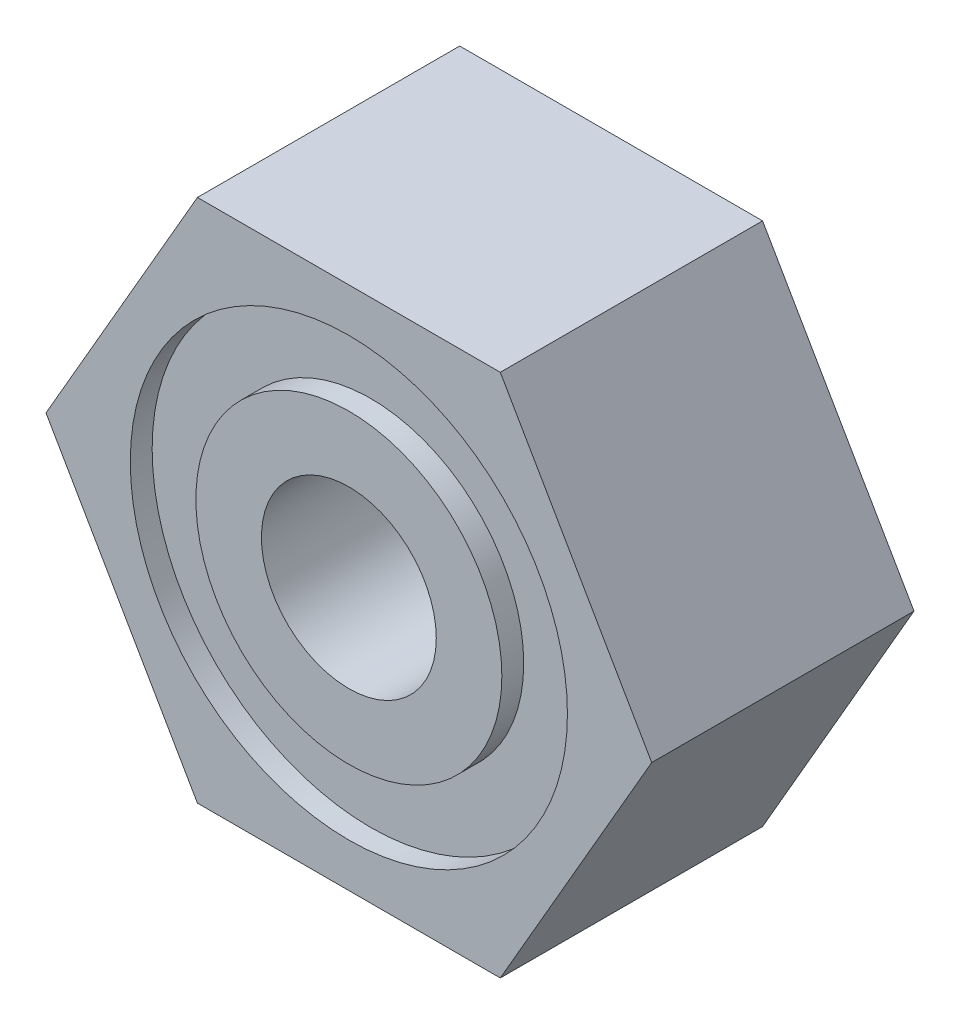
ISO-10303-21;
HEADER;
FILE_DESCRIPTION(('STEP AP214'),'2;1');
FILE_NAME('part.step','',(''),(''),'','','');
FILE_SCHEMA(('AUTOMOTIVE_DESIGN { 1 0 10303 214 1 1 1 1 }'));
ENDSEC;
DATA;
#1=APPLICATION_CONTEXT('core data for automotive mechanical design processes');
#2=APPLICATION_PROTOCOL_DEFINITION('international standard','automotive_design',2000,#1);
#3=PRODUCT_CONTEXT('',#1,'mechanical');
#4=PRODUCT('Part','Part','',(#3));
#5=PRODUCT_RELATED_PRODUCT_CATEGORY('part','',(#4));
#6=PRODUCT_DEFINITION_FORMATION('','',#4);
#7=PRODUCT_DEFINITION_CONTEXT('part definition',#1,'design');
#8=PRODUCT_DEFINITION('design','',#6,#7);
#9=PRODUCT_DEFINITION_SHAPE('','',#8);
#10=(LENGTH_UNIT() NAMED_UNIT(*) SI_UNIT(.MILLI.,.METRE.));
#11=(NAMED_UNIT(*) PLANE_ANGLE_UNIT() SI_UNIT($,.RADIAN.));
#12=(NAMED_UNIT(*) SI_UNIT($,.STERADIAN.) SOLID_ANGLE_UNIT());
#13=UNCERTAINTY_MEASURE_WITH_UNIT(LENGTH_MEASURE(1.E-05),#10,'distance_accuracy_value','');
#14=(GEOMETRIC_REPRESENTATION_CONTEXT(3) GLOBAL_UNCERTAINTY_ASSIGNED_CONTEXT((#13)) GLOBAL_UNIT_ASSIGNED_CONTEXT((#10,
#11,#12)) REPRESENTATION_CONTEXT('',''));
#15=CARTESIAN_POINT('',(0.,0.,0.));
#16=DIRECTION('',(0.,0.,1.));
#17=DIRECTION('',(1.,0.,0.));
#18=AXIS2_PLACEMENT_3D('',#15,#16,#17);
#19=CARTESIAN_POINT('',(0.,0.,6.));
#20=DIRECTION('',(0.,0.,1.));
#21=DIRECTION('',(1.,0.,0.));
#22=AXIS2_PLACEMENT_3D('',#19,#20,#21);
#23=PLANE('',#22);
#24=CARTESIAN_POINT('',(0.,0.,6.));
#25=DIRECTION('',(0.,0.,1.));
#26=DIRECTION('',(1.,0.,0.));
#27=AXIS2_PLACEMENT_3D('',#24,#25,#26);
#28=CIRCLE('',#27,2.);
#29=CARTESIAN_POINT('',(2.,0.,6.));
#30=VERTEX_POINT('',#29);
#31=EDGE_CURVE('E143',#30,#30,#28,.T.);
#32=ORIENTED_EDGE('',*,*,#31,.F.);
#33=EDGE_LOOP('',(#32));
#34=FACE_BOUND('',#33,.T.);
#35=CARTESIAN_POINT('',(0.,0.,6.));
#36=DIRECTION('',(0.,0.,1.));
#37=DIRECTION('',(1.,0.,0.));
#38=AXIS2_PLACEMENT_3D('',#35,#36,#37);
#39=CIRCLE('',#38,3.5);
#40=CARTESIAN_POINT('',(3.5,0.,6.));
#41=VERTEX_POINT('',#40);
#42=EDGE_CURVE('E128',#41,#41,#39,.T.);
#43=ORIENTED_EDGE('',*,*,#42,.T.);
#44=EDGE_LOOP('',(#43));
#45=FACE_BOUND('',#44,.T.);
#46=ADVANCED_FACE('F34',(#34,#45),#23,.T.);
#47=CARTESIAN_POINT('',(0.,0.,6.));
#48=DIRECTION('',(0.,0.,1.));
#49=DIRECTION('',(1.,0.,0.));
#50=AXIS2_PLACEMENT_3D('',#47,#48,#49);
#51=CIRCLE('',#50,5.);
#52=CARTESIAN_POINT('',(5.,0.,6.));
#53=VERTEX_POINT('',#52);
#54=EDGE_CURVE('E145',#53,#53,#51,.T.);
#55=ORIENTED_EDGE('',*,*,#54,.F.);
#56=EDGE_LOOP('',(#55));
#57=FACE_BOUND('',#56,.T.);
#58=DIRECTION('',(1.,0.,0.));
#59=VECTOR('',#58,1.);
#60=CARTESIAN_POINT('',(-3.46410161513776,-6.,6.));
#61=LINE('',#60,#59);
#62=CARTESIAN_POINT('',(-3.46410161513776,-6.,6.));
#63=VERTEX_POINT('',#62);
#64=CARTESIAN_POINT('',(3.46410161513776,-6.,6.));
#65=VERTEX_POINT('',#64);
#66=EDGE_CURVE('E150',#63,#65,#61,.T.);
#67=ORIENTED_EDGE('',*,*,#66,.T.);
#68=DIRECTION('',(0.5,0.866025403784439,0.));
#69=VECTOR('',#68,1.);
#70=CARTESIAN_POINT('',(3.46410161513776,-6.,6.));
#71=LINE('',#70,#69);
#72=CARTESIAN_POINT('',(6.92820323027551,0.,6.));
#73=VERTEX_POINT('',#72);
#74=EDGE_CURVE('E153',#65,#73,#71,.T.);
#75=ORIENTED_EDGE('',*,*,#74,.T.);
#76=DIRECTION('',(-0.5,0.866025403784439,0.));
#77=VECTOR('',#76,1.);
#78=CARTESIAN_POINT('',(6.92820323027551,0.,6.));
#79=LINE('',#78,#77);
#80=CARTESIAN_POINT('',(3.46410161513776,6.,6.));
#81=VERTEX_POINT('',#80);
#82=EDGE_CURVE('E156',#73,#81,#79,.T.);
#83=ORIENTED_EDGE('',*,*,#82,.T.);
#84=DIRECTION('',(-1.,0.,0.));
#85=VECTOR('',#84,1.);
#86=CARTESIAN_POINT('',(3.46410161513776,6.,6.));
#87=LINE('',#86,#85);
#88=CARTESIAN_POINT('',(-3.46410161513776,6.,6.));
#89=VERTEX_POINT('',#88);
#90=EDGE_CURVE('E158',#81,#89,#87,.T.);
#91=ORIENTED_EDGE('',*,*,#90,.T.);
#92=DIRECTION('',(-0.5,-0.866025403784439,0.));
#93=VECTOR('',#92,1.);
#94=CARTESIAN_POINT('',(-3.46410161513776,6.,6.));
#95=LINE('',#94,#93);
#96=CARTESIAN_POINT('',(-6.92820323027551,0.,6.));
#97=VERTEX_POINT('',#96);
#98=EDGE_CURVE('E160',#89,#97,#95,.T.);
#99=ORIENTED_EDGE('',*,*,#98,.T.);
#100=DIRECTION('',(0.5,-0.866025403784439,0.));
#101=VECTOR('',#100,1.);
#102=CARTESIAN_POINT('',(-6.92820323027551,0.,6.));
#103=LINE('',#102,#101);
#104=EDGE_CURVE('E162',#97,#63,#103,.T.);
#105=ORIENTED_EDGE('',*,*,#104,.T.);
#106=EDGE_LOOP('',(#67,#75,#83,#91,#99,#105));
#107=FACE_BOUND('',#106,.T.);
#108=ADVANCED_FACE('F233',(#57,#107),#23,.T.);
#109=CARTESIAN_POINT('',(0.,0.,0.));
#110=DIRECTION('',(0.,0.,1.));
#111=DIRECTION('',(1.,0.,0.));
#112=AXIS2_PLACEMENT_3D('',#109,#110,#111);
#113=PLANE('',#112);
#114=DIRECTION('',(0.866025403784439,0.5,0.));
#115=VECTOR('',#114,1.);
#116=CARTESIAN_POINT('',(-2.75,4.76313972081441,0.));
#117=LINE('',#116,#115);
#118=CARTESIAN_POINT('',(-3.61602540378444,4.26313972081441,0.));
#119=VERTEX_POINT('',#118);
#120=CARTESIAN_POINT('',(-1.88397459621556,5.26313972081441,0.));
#121=VERTEX_POINT('',#120);
#122=EDGE_CURVE('E11',#119,#121,#117,.T.);
#123=ORIENTED_EDGE('',*,*,#122,.F.);
#124=DIRECTION('',(0.5,-0.866025403784439,0.));
#125=VECTOR('',#124,1.);
#126=CARTESIAN_POINT('',(-3.61602540378444,4.26313972081441,0.));
#127=LINE('',#126,#125);
#128=CARTESIAN_POINT('',(-1.73205080756888,1.,0.));
#129=VERTEX_POINT('',#128);
#130=EDGE_CURVE('E117',#119,#129,#127,.T.);
#131=ORIENTED_EDGE('',*,*,#130,.T.);
#132=CARTESIAN_POINT('',(0.,0.,0.));
#133=DIRECTION('',(0.,0.,1.));
#134=DIRECTION('',(1.,0.,0.));
#135=AXIS2_PLACEMENT_3D('',#132,#133,#134);
#136=CIRCLE('',#135,2.);
#137=CARTESIAN_POINT('',(0.,-2.,0.));
#138=VERTEX_POINT('',#137);
#139=EDGE_CURVE('E140',#129,#138,#136,.T.);
#140=ORIENTED_EDGE('',*,*,#139,.T.);
#141=CARTESIAN_POINT('',(1.88397459621556,-5.26313972081441,0.));
#142=VERTEX_POINT('',#141);
#143=EDGE_CURVE('E49',#138,#142,#127,.T.);
#144=ORIENTED_EDGE('',*,*,#143,.T.);
#145=DIRECTION('',(0.866025403784439,0.5,0.));
#146=VECTOR('',#145,1.);
#147=CARTESIAN_POINT('',(2.75,-4.76313972081441,0.));
#148=LINE('',#147,#146);
#149=CARTESIAN_POINT('',(3.61602540378444,-4.26313972081441,0.));
#150=VERTEX_POINT('',#149);
#151=EDGE_CURVE('E42',#142,#150,#148,.T.);
#152=ORIENTED_EDGE('',*,*,#151,.T.);
#153=DIRECTION('',(0.5,-0.866025403784439,0.));
#154=VECTOR('',#153,1.);
#155=CARTESIAN_POINT('',(-1.88397459621556,5.26313972081441,0.));
#156=LINE('',#155,#154);
#157=CARTESIAN_POINT('',(1.73205080756888,-1.,0.));
#158=VERTEX_POINT('',#157);
#159=EDGE_CURVE('E118',#150,#158,#156,.F.);
#160=ORIENTED_EDGE('',*,*,#159,.T.);
#161=CARTESIAN_POINT('',(0.,2.,0.));
#162=VERTEX_POINT('',#161);
#163=EDGE_CURVE('E126',#158,#162,#136,.T.);
#164=ORIENTED_EDGE('',*,*,#163,.T.);
#165=EDGE_CURVE('E57',#162,#121,#156,.F.);
#166=ORIENTED_EDGE('',*,*,#165,.T.);
#167=EDGE_LOOP('',(#123,#131,#140,#144,#152,#160,#164,#166));
#168=FACE_BOUND('',#167,.T.);
#169=DIRECTION('',(1.,0.,0.));
#170=VECTOR('',#169,1.);
#171=CARTESIAN_POINT('',(-3.46410161513776,-6.,0.));
#172=LINE('',#171,#170);
#173=CARTESIAN_POINT('',(-3.46410161513776,-6.,0.));
#174=VERTEX_POINT('',#173);
#175=CARTESIAN_POINT('',(3.46410161513776,-6.,0.));
#176=VERTEX_POINT('',#175);
#177=EDGE_CURVE('E165',#174,#176,#172,.T.);
#178=ORIENTED_EDGE('',*,*,#177,.F.);
#179=DIRECTION('',(0.5,-0.866025403784439,0.));
#180=VECTOR('',#179,1.);
#181=CARTESIAN_POINT('',(-6.92820323027551,0.,0.));
#182=LINE('',#181,#180);
#183=CARTESIAN_POINT('',(-6.92820323027551,0.,0.));
#184=VERTEX_POINT('',#183);
#185=EDGE_CURVE('E154',#184,#174,#182,.T.);
#186=ORIENTED_EDGE('',*,*,#185,.F.);
#187=DIRECTION('',(-0.5,-0.866025403784439,0.));
#188=VECTOR('',#187,1.);
#189=CARTESIAN_POINT('',(-3.46410161513776,6.,0.));
#190=LINE('',#189,#188);
#191=CARTESIAN_POINT('',(-3.46410161513776,6.,0.));
#192=VERTEX_POINT('',#191);
#193=EDGE_CURVE('E174',#192,#184,#190,.T.);
#194=ORIENTED_EDGE('',*,*,#193,.F.);
#195=DIRECTION('',(-1.,0.,0.));
#196=VECTOR('',#195,1.);
#197=CARTESIAN_POINT('',(3.46410161513776,6.,0.));
#198=LINE('',#197,#196);
#199=CARTESIAN_POINT('',(3.46410161513776,6.,0.));
#200=VERTEX_POINT('',#199);
#201=EDGE_CURVE('E172',#200,#192,#198,.T.);
#202=ORIENTED_EDGE('',*,*,#201,.F.);
#203=DIRECTION('',(-0.5,0.866025403784439,0.));
#204=VECTOR('',#203,1.);
#205=CARTESIAN_POINT('',(6.92820323027551,0.,0.));
#206=LINE('',#205,#204);
#207=CARTESIAN_POINT('',(6.92820323027551,0.,0.));
#208=VERTEX_POINT('',#207);
#209=EDGE_CURVE('E170',#208,#200,#206,.T.);
#210=ORIENTED_EDGE('',*,*,#209,.F.);
#211=DIRECTION('',(0.5,0.866025403784439,0.));
#212=VECTOR('',#211,1.);
#213=CARTESIAN_POINT('',(3.46410161513776,-6.,0.));
#214=LINE('',#213,#212);
#215=EDGE_CURVE('E168',#176,#208,#214,.T.);
#216=ORIENTED_EDGE('',*,*,#215,.F.);
#217=EDGE_LOOP('',(#178,#186,#194,#202,#210,#216));
#218=FACE_BOUND('',#217,.T.);
#219=ADVANCED_FACE('F122',(#168,#218),#113,.F.);
#220=CARTESIAN_POINT('',(-3.46410161513776,-6.,6.));
#221=DIRECTION('',(0.,1.,0.));
#222=DIRECTION('',(0.,0.,1.));
#223=AXIS2_PLACEMENT_3D('',#220,#221,#222);
#224=PLANE('',#223);
#225=ORIENTED_EDGE('',*,*,#177,.T.);
#226=DIRECTION('',(0.,0.,-1.));
#227=VECTOR('',#226,1.);
#228=CARTESIAN_POINT('',(3.46410161513776,-6.,6.));
#229=LINE('',#228,#227);
#230=EDGE_CURVE('E191',#65,#176,#229,.T.);
#231=ORIENTED_EDGE('',*,*,#230,.F.);
#232=ORIENTED_EDGE('',*,*,#66,.F.);
#233=DIRECTION('',(0.,0.,-1.));
#234=VECTOR('',#233,1.);
#235=CARTESIAN_POINT('',(-3.46410161513776,-6.,6.));
#236=LINE('',#235,#234);
#237=EDGE_CURVE('E164',#63,#174,#236,.T.);
#238=ORIENTED_EDGE('',*,*,#237,.T.);
#239=EDGE_LOOP('',(#225,#231,#232,#238));
#240=FACE_BOUND('',#239,.T.);
#241=ADVANCED_FACE('F36',(#240),#224,.F.);
#242=CARTESIAN_POINT('',(3.46410161513776,-6.,6.));
#243=DIRECTION('',(-0.866025403784439,0.5,0.));
#244=DIRECTION('',(-0.5,-0.866025403784439,0.));
#245=AXIS2_PLACEMENT_3D('',#242,#243,#244);
#246=PLANE('',#245);
#247=ORIENTED_EDGE('',*,*,#215,.T.);
#248=DIRECTION('',(0.,0.,-1.));
#249=VECTOR('',#248,1.);
#250=CARTESIAN_POINT('',(6.92820323027551,0.,6.));
#251=LINE('',#250,#249);
#252=EDGE_CURVE('E188',#73,#208,#251,.T.);
#253=ORIENTED_EDGE('',*,*,#252,.F.);
#254=ORIENTED_EDGE('',*,*,#74,.F.);
#255=ORIENTED_EDGE('',*,*,#230,.T.);
#256=EDGE_LOOP('',(#247,#253,#254,#255));
#257=FACE_BOUND('',#256,.T.);
#258=ADVANCED_FACE('F257',(#257),#246,.F.);
#259=CARTESIAN_POINT('',(6.92820323027551,0.,6.));
#260=DIRECTION('',(-0.866025403784439,-0.5,0.));
#261=DIRECTION('',(0.5,-0.866025403784439,0.));
#262=AXIS2_PLACEMENT_3D('',#259,#260,#261);
#263=PLANE('',#262);
#264=ORIENTED_EDGE('',*,*,#209,.T.);
#265=DIRECTION('',(0.,0.,-1.));
#266=VECTOR('',#265,1.);
#267=CARTESIAN_POINT('',(3.46410161513776,6.,6.));
#268=LINE('',#267,#266);
#269=EDGE_CURVE('E185',#81,#200,#268,.T.);
#270=ORIENTED_EDGE('',*,*,#269,.F.);
#271=ORIENTED_EDGE('',*,*,#82,.F.);
#272=ORIENTED_EDGE('',*,*,#252,.T.);
#273=EDGE_LOOP('',(#264,#270,#271,#272));
#274=FACE_BOUND('',#273,.T.);
#275=ADVANCED_FACE('F254',(#274),#263,.F.);
#276=CARTESIAN_POINT('',(3.46410161513776,6.,6.));
#277=DIRECTION('',(0.,-1.,0.));
#278=DIRECTION('',(1.,0.,0.));
#279=AXIS2_PLACEMENT_3D('',#276,#277,#278);
#280=PLANE('',#279);
#281=ORIENTED_EDGE('',*,*,#201,.T.);
#282=DIRECTION('',(0.,0.,-1.));
#283=VECTOR('',#282,1.);
#284=CARTESIAN_POINT('',(-3.46410161513776,6.,6.));
#285=LINE('',#284,#283);
#286=EDGE_CURVE('E182',#89,#192,#285,.T.);
#287=ORIENTED_EDGE('',*,*,#286,.F.);
#288=ORIENTED_EDGE('',*,*,#90,.F.);
#289=ORIENTED_EDGE('',*,*,#269,.T.);
#290=EDGE_LOOP('',(#281,#287,#288,#289));
#291=FACE_BOUND('',#290,.T.);
#292=ADVANCED_FACE('F250',(#291),#280,.F.);
#293=CARTESIAN_POINT('',(-3.46410161513776,6.,6.));
#294=DIRECTION('',(0.866025403784439,-0.5,0.));
#295=DIRECTION('',(0.5,0.866025403784439,0.));
#296=AXIS2_PLACEMENT_3D('',#293,#294,#295);
#297=PLANE('',#296);
#298=ORIENTED_EDGE('',*,*,#193,.T.);
#299=DIRECTION('',(0.,0.,-1.));
#300=VECTOR('',#299,1.);
#301=CARTESIAN_POINT('',(-6.92820323027551,0.,6.));
#302=LINE('',#301,#300);
#303=EDGE_CURVE('E179',#97,#184,#302,.T.);
#304=ORIENTED_EDGE('',*,*,#303,.F.);
#305=ORIENTED_EDGE('',*,*,#98,.F.);
#306=ORIENTED_EDGE('',*,*,#286,.T.);
#307=EDGE_LOOP('',(#298,#304,#305,#306));
#308=FACE_BOUND('',#307,.T.);
#309=ADVANCED_FACE('F246',(#308),#297,.F.);
#310=CARTESIAN_POINT('',(-6.92820323027551,0.,6.));
#311=DIRECTION('',(0.866025403784439,0.5,0.));
#312=DIRECTION('',(-0.5,0.866025403784439,0.));
#313=AXIS2_PLACEMENT_3D('',#310,#311,#312);
#314=PLANE('',#313);
#315=ORIENTED_EDGE('',*,*,#185,.T.);
#316=ORIENTED_EDGE('',*,*,#237,.F.);
#317=ORIENTED_EDGE('',*,*,#104,.F.);
#318=ORIENTED_EDGE('',*,*,#303,.T.);
#319=EDGE_LOOP('',(#315,#316,#317,#318));
#320=FACE_BOUND('',#319,.T.);
#321=ADVANCED_FACE('F229',(#320),#314,.F.);
#322=CARTESIAN_POINT('',(0.,0.,6.));
#323=DIRECTION('',(0.,0.,-1.));
#324=DIRECTION('',(-1.,0.,0.));
#325=AXIS2_PLACEMENT_3D('',#322,#323,#324);
#326=CYLINDRICAL_SURFACE('',#325,2.);
#327=CARTESIAN_POINT('',(0.,2.,0.));
#328=CARTESIAN_POINT('',(4.28921103924436E-06,1.99999647146179,0.0261960428413932));
#329=CARTESIAN_POINT('',(-0.00118953318676079,2.0000003024161,0.0523772012210233));
#330=CARTESIAN_POINT('',(-0.00592318796311009,1.99999337431,0.104510828743244));
#331=CARTESIAN_POINT('',(-0.00946157894519083,1.99998262420949,0.130463428472383));
#332=CARTESIAN_POINT('',(-0.0234588839131619,1.99988505717229,0.207389468814431));
#333=CARTESIAN_POINT('',(-0.0373013743491035,1.99973364420531,0.257780810821199));
#334=CARTESIAN_POINT('',(-0.0730466444280896,1.99874398349684,0.355426248702167));
#335=CARTESIAN_POINT('',(-0.0949330315799592,1.99790712837217,0.402686495793944));
#336=CARTESIAN_POINT('',(-0.145630237305601,1.99485248262373,0.493355832464106));
#337=CARTESIAN_POINT('',(-0.174451780742134,1.99263254459944,0.536758813213403));
#338=CARTESIAN_POINT('',(-0.24044708513753,1.98579244271814,0.622311744447291));
#339=CARTESIAN_POINT('',(-0.278111163358129,1.9809908181976,0.664068874363121));
#340=CARTESIAN_POINT('',(-0.358814776598035,1.96797428155245,0.741416202641452));
#341=CARTESIAN_POINT('',(-0.401855764565462,1.95975844543848,0.777004727894626));
#342=CARTESIAN_POINT('',(-0.49502949948947,1.93839574434868,0.843367089187636));
#343=CARTESIAN_POINT('',(-0.545444865278149,1.92495337697439,0.873653553531627));
#344=CARTESIAN_POINT('',(-0.649063629417607,1.89252608819916,0.925140671150152));
#345=CARTESIAN_POINT('',(-0.702265266221066,1.87354463484571,0.946346989110673));
#346=CARTESIAN_POINT('',(-0.805569438804968,1.83137795546041,0.977504543660903));
#347=CARTESIAN_POINT('',(-0.855623082233814,1.80858802547053,0.988149354159685));
#348=CARTESIAN_POINT('',(-0.954509618620689,1.75840224830164,1.00016609382156));
#349=CARTESIAN_POINT('',(-1.00334321344483,1.73100912274656,1.00154348268274));
#350=CARTESIAN_POINT('',(-1.09393307959954,1.67508165322525,0.995253298261928));
#351=CARTESIAN_POINT('',(-1.13593551405457,1.64685369444291,0.988361854357728));
#352=CARTESIAN_POINT('',(-1.2164442780128,1.58831389226728,0.967118879593874));
#353=CARTESIAN_POINT('',(-1.25495041244406,1.55800193276523,0.952766932784321));
#354=CARTESIAN_POINT('',(-1.32826779486375,1.49600923259716,0.916917575943656));
#355=CARTESIAN_POINT('',(-1.36302054133772,1.46431535539041,0.895324037905615));
#356=CARTESIAN_POINT('',(-1.42785731271512,1.40116903763456,0.845736968227679));
#357=CARTESIAN_POINT('',(-1.45793959021625,1.3697166916149,0.81774105085236));
#358=CARTESIAN_POINT('',(-1.51594715881099,1.30535579539067,0.753106959635575));
#359=CARTESIAN_POINT('',(-1.54340037661049,1.27259027992897,0.715902275909345));
#360=CARTESIAN_POINT('',(-1.59266296157131,1.2103730190917,0.635415419388301));
#361=CARTESIAN_POINT('',(-1.61446725375624,1.18092426681671,0.592127835206171));
#362=CARTESIAN_POINT('',(-1.65374817493362,1.12532214902253,0.497320272929193));
#363=CARTESIAN_POINT('',(-1.67085736595768,1.09950145895152,0.445450291407332));
#364=CARTESIAN_POINT('',(-1.69883124041557,1.05577083557,0.336977012611891));
#365=CARTESIAN_POINT('',(-1.70971089113514,1.03784196532555,0.280385437962877));
#366=CARTESIAN_POINT('',(-1.72233148624834,1.01669340797449,0.186089084719236));
#367=CARTESIAN_POINT('',(-1.72597060246439,1.01047760096968,0.149287023848427));
#368=CARTESIAN_POINT('',(-1.73083167145521,1.00211226839256,0.0750035320383384));
#369=CARTESIAN_POINT('',(-1.73204935733643,0.999969921107523,0.0375210190860107));
#370=CARTESIAN_POINT('',(-1.73205080756888,1.,0.));
#371=B_SPLINE_CURVE_WITH_KNOTS('',3,(#327,#328,#329,#330,#331,#332,#333,#334,#335,#336,#337,
#338,#339,#340,#341,#342,#343,#344,#345,#346,#347,#348,#349,#350,#351,#352,#353,#354,#355,#356,
#357,#358,#359,#360,#361,#362,#363,#364,#365,#366,#367,#368,#369,#370),.UNSPECIFIED.,.F.,.F.,(4,
2,2,2,2,2,2,2,2,2,2,2,2,2,2,2,2,2,2,2,2,4),(0.,0.0785326222006868,0.157017008768958,
0.312951858899484,0.468570678850407,0.624431719704133,0.793040382538525,0.961694705745677,
1.14173722727346,1.32166726431661,1.48879248123988,1.6558192313817,1.80832142369327,
1.96083211946322,2.11545319823069,2.27013198801097,2.43941995018337,2.60885947680375,
2.78917066212819,2.96904678850595,3.08126318733152,3.19367715228911),.UNSPECIFIED.);
#372=EDGE_CURVE('E139',#162,#129,#371,.T.);
#373=ORIENTED_EDGE('',*,*,#372,.F.);
#374=ORIENTED_EDGE('',*,*,#163,.F.);
#375=CARTESIAN_POINT('',(0.,-2.,0.));
#376=CARTESIAN_POINT('',(-4.28921103891087E-06,-1.99999647146179,0.0261960428413933));
#377=CARTESIAN_POINT('',(0.00118953318676104,-2.0000003024161,0.0523772012210235));
#378=CARTESIAN_POINT('',(0.00592318796310997,-1.99999337431,0.104510828743244));
#379=CARTESIAN_POINT('',(0.00946157894519044,-1.99998262420949,0.130463428472383));
#380=CARTESIAN_POINT('',(0.0234588839131614,-1.99988505717229,0.207389468814431));
#381=CARTESIAN_POINT('',(0.0373013743491039,-1.99973364420531,0.257780810821199));
#382=CARTESIAN_POINT('',(0.0730466444280905,-1.99874398349684,0.355426248702167));
#383=CARTESIAN_POINT('',(0.0949330315799596,-1.99790712837217,0.402686495793944));
#384=CARTESIAN_POINT('',(0.145630237305602,-1.99485248262373,0.493355832464106));
#385=CARTESIAN_POINT('',(0.174451780742135,-1.99263254459944,0.536758813213403));
#386=CARTESIAN_POINT('',(0.240447085137531,-1.98579244271814,0.622311744447291));
#387=CARTESIAN_POINT('',(0.278111163358129,-1.9809908181976,0.664068874363122));
#388=CARTESIAN_POINT('',(0.358814776598035,-1.96797428155245,0.741416202641452));
#389=CARTESIAN_POINT('',(0.401855764565463,-1.95975844543848,0.777004727894627));
#390=CARTESIAN_POINT('',(0.495029499489471,-1.93839574434868,0.843367089187636));
#391=CARTESIAN_POINT('',(0.545444865278149,-1.92495337697439,0.873653553531627));
#392=CARTESIAN_POINT('',(0.649063629417608,-1.89252608819916,0.925140671150152));
#393=CARTESIAN_POINT('',(0.702265266221067,-1.87354463484571,0.946346989110673));
#394=CARTESIAN_POINT('',(0.805569438804969,-1.83137795546041,0.977504543660903));
#395=CARTESIAN_POINT('',(0.855623082233815,-1.80858802547053,0.988149354159685));
#396=CARTESIAN_POINT('',(0.954509618620689,-1.75840224830164,1.00016609382156));
#397=CARTESIAN_POINT('',(1.00334321344483,-1.73100912274656,1.00154348268274));
#398=CARTESIAN_POINT('',(1.09393307959954,-1.67508165322524,0.995253298261928));
#399=CARTESIAN_POINT('',(1.13593551405457,-1.64685369444291,0.988361854357728));
#400=CARTESIAN_POINT('',(1.2164442780128,-1.58831389226728,0.967118879593874));
#401=CARTESIAN_POINT('',(1.25495041244406,-1.55800193276523,0.952766932784321));
#402=CARTESIAN_POINT('',(1.32826779486375,-1.49600923259716,0.916917575943656));
#403=CARTESIAN_POINT('',(1.36302054133772,-1.46431535539041,0.895324037905615));
#404=CARTESIAN_POINT('',(1.42785731271512,-1.40116903763456,0.845736968227679));
#405=CARTESIAN_POINT('',(1.45793959021625,-1.3697166916149,0.817741050852361));
#406=CARTESIAN_POINT('',(1.51594715881099,-1.30535579539067,0.753106959635576));
#407=CARTESIAN_POINT('',(1.54340037661049,-1.27259027992897,0.715902275909346));
#408=CARTESIAN_POINT('',(1.59266296157131,-1.2103730190917,0.635415419388301));
#409=CARTESIAN_POINT('',(1.61446725375624,-1.18092426681672,0.592127835206172));
#410=CARTESIAN_POINT('',(1.65374817493362,-1.12532214902253,0.497320272929194));
#411=CARTESIAN_POINT('',(1.67085736595768,-1.09950145895152,0.445450291407333));
#412=CARTESIAN_POINT('',(1.69883124041557,-1.05577083557,0.336977012611892));
#413=CARTESIAN_POINT('',(1.70971089113514,-1.03784196532555,0.280385437962878));
#414=CARTESIAN_POINT('',(1.72233148624834,-1.01669340797449,0.186089084719236));
#415=CARTESIAN_POINT('',(1.72597060246439,-1.01047760096968,0.149287023848427));
#416=CARTESIAN_POINT('',(1.73083167145521,-1.00211226839256,0.0750035320383381));
#417=CARTESIAN_POINT('',(1.73204935733643,-0.999969921107524,0.0375210190860104));
#418=CARTESIAN_POINT('',(1.73205080756888,-1.,0.));
#419=B_SPLINE_CURVE_WITH_KNOTS('',3,(#375,#376,#377,#378,#379,#380,#381,#382,#383,#384,#385,
#386,#387,#388,#389,#390,#391,#392,#393,#394,#395,#396,#397,#398,#399,#400,#401,#402,#403,#404,
#405,#406,#407,#408,#409,#410,#411,#412,#413,#414,#415,#416,#417,#418),.UNSPECIFIED.,.F.,.F.,(4,
2,2,2,2,2,2,2,2,2,2,2,2,2,2,2,2,2,2,2,2,4),(0.,0.078532622200687,0.157017008768958,
0.312951858899485,0.468570678850407,0.624431719704134,0.793040382538525,0.961694705745678,
1.14173722727346,1.32166726431661,1.48879248123988,1.6558192313817,1.80832142369327,
1.96083211946322,2.11545319823069,2.27013198801097,2.43941995018337,2.60885947680375,
2.78917066212819,2.96904678850595,3.08126318733152,3.19367715228911),.UNSPECIFIED.);
#420=EDGE_CURVE('E137',#138,#158,#419,.T.);
#421=ORIENTED_EDGE('',*,*,#420,.F.);
#422=ORIENTED_EDGE('',*,*,#139,.F.);
#423=EDGE_LOOP('',(#373,#374,#421,#422));
#424=FACE_BOUND('',#423,.T.);
#425=ORIENTED_EDGE('',*,*,#31,.T.);
#426=EDGE_LOOP('',(#425));
#427=FACE_BOUND('',#426,.T.);
#428=ADVANCED_FACE('F134',(#424,#427),#326,.F.);
#429=CARTESIAN_POINT('',(0.,0.,5.5));
#430=DIRECTION('',(0.,0.,1.));
#431=DIRECTION('',(1.,0.,0.));
#432=AXIS2_PLACEMENT_3D('',#429,#430,#431);
#433=CYLINDRICAL_SURFACE('',#432,5.);
#434=CARTESIAN_POINT('',(0.,0.,5.5));
#435=DIRECTION('',(0.,0.,1.));
#436=DIRECTION('',(1.,0.,0.));
#437=AXIS2_PLACEMENT_3D('',#434,#435,#436);
#438=CIRCLE('',#437,5.);
#439=CARTESIAN_POINT('',(5.,0.,5.5));
#440=VERTEX_POINT('',#439);
#441=EDGE_CURVE('E141',#440,#440,#438,.T.);
#442=ORIENTED_EDGE('',*,*,#441,.F.);
#443=EDGE_LOOP('',(#442));
#444=FACE_BOUND('',#443,.T.);
#445=ORIENTED_EDGE('',*,*,#54,.T.);
#446=EDGE_LOOP('',(#445));
#447=FACE_BOUND('',#446,.T.);
#448=ADVANCED_FACE('F222',(#444,#447),#433,.F.);
#449=CARTESIAN_POINT('',(0.,0.,5.5));
#450=DIRECTION('',(0.,0.,1.));
#451=DIRECTION('',(1.,0.,0.));
#452=AXIS2_PLACEMENT_3D('',#449,#450,#451);
#453=PLANE('',#452);
#454=CARTESIAN_POINT('',(0.,0.,5.5));
#455=DIRECTION('',(0.,0.,1.));
#456=DIRECTION('',(1.,0.,0.));
#457=AXIS2_PLACEMENT_3D('',#454,#455,#456);
#458=CIRCLE('',#457,3.5);
#459=CARTESIAN_POINT('',(3.5,0.,5.5));
#460=VERTEX_POINT('',#459);
#461=EDGE_CURVE('E386',#460,#460,#458,.T.);
#462=ORIENTED_EDGE('',*,*,#461,.F.);
#463=EDGE_LOOP('',(#462));
#464=FACE_BOUND('',#463,.T.);
#465=ORIENTED_EDGE('',*,*,#441,.T.);
#466=EDGE_LOOP('',(#465));
#467=FACE_BOUND('',#466,.T.);
#468=ADVANCED_FACE('F219',(#464,#467),#453,.T.);
#469=CARTESIAN_POINT('',(0.,0.,5.5));
#470=DIRECTION('',(0.,0.,1.));
#471=DIRECTION('',(1.,0.,0.));
#472=AXIS2_PLACEMENT_3D('',#469,#470,#471);
#473=CYLINDRICAL_SURFACE('',#472,3.5);
#474=ORIENTED_EDGE('',*,*,#461,.T.);
#475=EDGE_LOOP('',(#474));
#476=FACE_BOUND('',#475,.T.);
#477=ORIENTED_EDGE('',*,*,#42,.F.);
#478=EDGE_LOOP('',(#477));
#479=FACE_BOUND('',#478,.T.);
#480=ADVANCED_FACE('F215',(#476,#479),#473,.T.);
#481=CARTESIAN_POINT('',(-2.75,4.76313972081441,0.));
#482=DIRECTION('',(0.5,-0.866025403784439,0.));
#483=DIRECTION('',(0.866025403784439,0.5,0.));
#484=AXIS2_PLACEMENT_3D('',#481,#482,#483);
#485=CYLINDRICAL_SURFACE('',#484,1.);
#486=ORIENTED_EDGE('',*,*,#420,.T.);
#487=ORIENTED_EDGE('',*,*,#159,.F.);
#488=CARTESIAN_POINT('',(2.75,-4.76313972081441,0.));
#489=DIRECTION('',(0.5,-0.866025403784439,0.));
#490=DIRECTION('',(0.866025403784439,0.5,0.));
#491=AXIS2_PLACEMENT_3D('',#488,#489,#490);
#492=CIRCLE('',#491,1.);
#493=EDGE_CURVE('E119',#150,#142,#492,.T.);
#494=ORIENTED_EDGE('',*,*,#493,.T.);
#495=ORIENTED_EDGE('',*,*,#143,.F.);
#496=EDGE_LOOP('',(#486,#487,#494,#495));
#497=FACE_BOUND('',#496,.T.);
#498=ADVANCED_FACE('F212',(#497),#485,.F.);
#499=CARTESIAN_POINT('',(2.75,-4.76313972081441,0.));
#500=DIRECTION('',(0.5,-0.866025403784439,0.));
#501=DIRECTION('',(0.866025403784439,0.5,0.));
#502=AXIS2_PLACEMENT_3D('',#499,#500,#501);
#503=PLANE('',#502);
#504=ORIENTED_EDGE('',*,*,#493,.F.);
#505=ORIENTED_EDGE('',*,*,#151,.F.);
#506=EDGE_LOOP('',(#504,#505));
#507=FACE_BOUND('',#506,.T.);
#508=ADVANCED_FACE('F213',(#507),#503,.F.);
#509=CARTESIAN_POINT('',(-2.75,4.76313972081441,0.));
#510=DIRECTION('',(0.5,-0.866025403784439,0.));
#511=DIRECTION('',(0.866025403784439,0.5,0.));
#512=AXIS2_PLACEMENT_3D('',#509,#510,#511);
#513=PLANE('',#512);
#514=ORIENTED_EDGE('',*,*,#122,.T.);
#515=CARTESIAN_POINT('',(-2.75,4.76313972081441,0.));
#516=DIRECTION('',(0.5,-0.866025403784439,0.));
#517=DIRECTION('',(0.866025403784439,0.5,0.));
#518=AXIS2_PLACEMENT_3D('',#515,#516,#517);
#519=CIRCLE('',#518,1.);
#520=EDGE_CURVE('E113',#121,#119,#519,.T.);
#521=ORIENTED_EDGE('',*,*,#520,.T.);
#522=EDGE_LOOP('',(#514,#521));
#523=FACE_BOUND('',#522,.T.);
#524=ADVANCED_FACE('F112',(#523),#513,.T.);
#525=ORIENTED_EDGE('',*,*,#520,.F.);
#526=ORIENTED_EDGE('',*,*,#165,.F.);
#527=ORIENTED_EDGE('',*,*,#372,.T.);
#528=ORIENTED_EDGE('',*,*,#130,.F.);
#529=EDGE_LOOP('',(#525,#526,#527,#528));
#530=FACE_BOUND('',#529,.T.);
#531=ADVANCED_FACE('F116',(#530),#485,.F.);
#532=CLOSED_SHELL('',(#46,#108,#219,#241,#258,#275,#292,#309,#321,#428,#448,#468,#480,#498,#508,
#524,#531));
#533=MANIFOLD_SOLID_BREP('B2',#532);
#534=ADVANCED_BREP_SHAPE_REPRESENTATION('',(#18,#533),#14);
#535=SHAPE_DEFINITION_REPRESENTATION(#9,#534);
ENDSEC;
END-ISO-10303-21;
